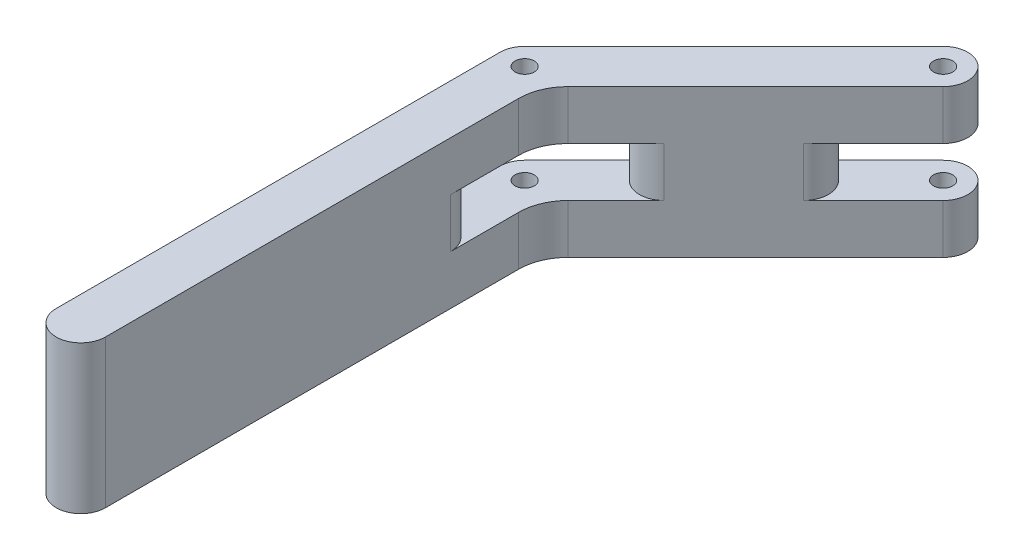
ISO-10303-21;
HEADER;
FILE_DESCRIPTION(('STEP AP214'),'2;1');
FILE_NAME('part.step','',(''),(''),'','','');
FILE_SCHEMA(('AUTOMOTIVE_DESIGN { 1 0 10303 214 1 1 1 1 }'));
ENDSEC;
DATA;
#1=APPLICATION_CONTEXT('core data for automotive mechanical design processes');
#2=APPLICATION_PROTOCOL_DEFINITION('international standard','automotive_design',2000,#1);
#3=PRODUCT_CONTEXT('',#1,'mechanical');
#4=PRODUCT('Part','Part','',(#3));
#5=PRODUCT_RELATED_PRODUCT_CATEGORY('part','',(#4));
#6=PRODUCT_DEFINITION_FORMATION('','',#4);
#7=PRODUCT_DEFINITION_CONTEXT('part definition',#1,'design');
#8=PRODUCT_DEFINITION('design','',#6,#7);
#9=PRODUCT_DEFINITION_SHAPE('','',#8);
#10=(LENGTH_UNIT() NAMED_UNIT(*) SI_UNIT(.MILLI.,.METRE.));
#11=(NAMED_UNIT(*) PLANE_ANGLE_UNIT() SI_UNIT($,.RADIAN.));
#12=(NAMED_UNIT(*) SI_UNIT($,.STERADIAN.) SOLID_ANGLE_UNIT());
#13=UNCERTAINTY_MEASURE_WITH_UNIT(LENGTH_MEASURE(1.E-05),#10,'distance_accuracy_value','');
#14=(GEOMETRIC_REPRESENTATION_CONTEXT(3) GLOBAL_UNCERTAINTY_ASSIGNED_CONTEXT((#13)) GLOBAL_UNIT_ASSIGNED_CONTEXT((#10,
#11,#12)) REPRESENTATION_CONTEXT('',''));
#15=CARTESIAN_POINT('',(0.,0.,0.));
#16=DIRECTION('',(0.,0.,1.));
#17=DIRECTION('',(1.,0.,0.));
#18=AXIS2_PLACEMENT_3D('',#15,#16,#17);
#19=CARTESIAN_POINT('',(0.,10.,0.));
#20=DIRECTION('',(0.,1.,0.));
#21=DIRECTION('',(0.,0.,1.));
#22=AXIS2_PLACEMENT_3D('',#19,#20,#21);
#23=PLANE('',#22);
#24=CARTESIAN_POINT('',(42.4264068711929,10.,-132.426406871193));
#25=DIRECTION('',(0.,1.,0.));
#26=DIRECTION('',(0.,0.,1.));
#27=AXIS2_PLACEMENT_3D('',#24,#25,#26);
#28=CIRCLE('',#27,1.95);
#29=CARTESIAN_POINT('',(42.4264068711929,10.,-130.476406871193));
#30=VERTEX_POINT('',#29);
#31=EDGE_CURVE('E285',#30,#30,#28,.T.);
#32=ORIENTED_EDGE('',*,*,#31,.F.);
#33=EDGE_LOOP('',(#32));
#34=FACE_BOUND('',#33,.T.);
#35=DIRECTION('',(0.707106781186549,0.,-0.707106781186546));
#36=VECTOR('',#35,1.);
#37=CARTESIAN_POINT('',(-48.5355339059327,10.,-48.5355339059329));
#38=LINE('',#37,#36);
#39=CARTESIAN_POINT('',(24.7487373415292,10.,-121.819805153395));
#40=VERTEX_POINT('',#39);
#41=CARTESIAN_POINT('',(38.8908729652602,10.,-135.961940777126));
#42=VERTEX_POINT('',#41);
#43=EDGE_CURVE('E57',#40,#42,#38,.T.);
#44=ORIENTED_EDGE('',*,*,#43,.F.);
#45=CARTESIAN_POINT('',(28.2842712474619,10.,-118.284271247462));
#46=DIRECTION('',(0.,1.,0.));
#47=DIRECTION('',(0.,0.,1.));
#48=AXIS2_PLACEMENT_3D('',#45,#46,#47);
#49=CIRCLE('',#48,4.99999999999999);
#50=CARTESIAN_POINT('',(31.8198051533947,10.,-114.748737341529));
#51=VERTEX_POINT('',#50);
#52=EDGE_CURVE('E209',#51,#40,#49,.T.);
#53=ORIENTED_EDGE('',*,*,#52,.F.);
#54=DIRECTION('',(0.707106781186548,0.,-0.707106781186547));
#55=VECTOR('',#54,1.);
#56=CARTESIAN_POINT('',(-41.4644660940673,10.,-41.4644660940674));
#57=LINE('',#56,#55);
#58=CARTESIAN_POINT('',(45.9619407771256,10.,-128.89087296526));
#59=VERTEX_POINT('',#58);
#60=EDGE_CURVE('E274',#51,#59,#57,.T.);
#61=ORIENTED_EDGE('',*,*,#60,.T.);
#62=CARTESIAN_POINT('',(42.4264068711929,10.,-132.426406871193));
#63=DIRECTION('',(0.,1.,0.));
#64=DIRECTION('',(0.,0.,1.));
#65=AXIS2_PLACEMENT_3D('',#62,#63,#64);
#66=CIRCLE('',#65,4.99999999999998);
#67=EDGE_CURVE('E278',#59,#42,#66,.T.);
#68=ORIENTED_EDGE('',*,*,#67,.T.);
#69=EDGE_LOOP('',(#44,#53,#61,#68));
#70=FACE_BOUND('',#69,.T.);
#71=ADVANCED_FACE('F41',(#34,#70),#23,.T.);
#72=CARTESIAN_POINT('',(0.,10.,-90.));
#73=DIRECTION('',(0.,1.,0.));
#74=DIRECTION('',(0.,0.,1.));
#75=AXIS2_PLACEMENT_3D('',#72,#73,#74);
#76=CIRCLE('',#75,1.95);
#77=CARTESIAN_POINT('',(0.,10.,-88.05));
#78=VERTEX_POINT('',#77);
#79=EDGE_CURVE('E281',#78,#78,#76,.T.);
#80=ORIENTED_EDGE('',*,*,#79,.F.);
#81=EDGE_LOOP('',(#80));
#82=FACE_BOUND('',#81,.T.);
#83=CARTESIAN_POINT('',(7.92893218813452,10.,-90.857864376269));
#84=VERTEX_POINT('',#83);
#85=CARTESIAN_POINT('',(17.6776695296637,10.,-100.606601717798));
#86=VERTEX_POINT('',#85);
#87=EDGE_CURVE('E275',#84,#86,#57,.T.);
#88=ORIENTED_EDGE('',*,*,#87,.T.);
#89=CARTESIAN_POINT('',(14.1421356237309,10.,-104.142135623731));
#90=DIRECTION('',(0.,1.,0.));
#91=DIRECTION('',(0.,0.,1.));
#92=AXIS2_PLACEMENT_3D('',#89,#90,#91);
#93=CIRCLE('',#92,5.);
#94=CARTESIAN_POINT('',(10.6066017177983,10.,-107.677669529664));
#95=VERTEX_POINT('',#94);
#96=EDGE_CURVE('E65',#95,#86,#93,.T.);
#97=ORIENTED_EDGE('',*,*,#96,.F.);
#98=CARTESIAN_POINT('',(-3.53553390593273,10.,-93.5355339059327));
#99=VERTEX_POINT('',#98);
#100=EDGE_CURVE('E261',#99,#95,#38,.T.);
#101=ORIENTED_EDGE('',*,*,#100,.F.);
#102=CARTESIAN_POINT('',(0.,10.,-90.));
#103=DIRECTION('',(0.,1.,0.));
#104=DIRECTION('',(0.,0.,1.));
#105=AXIS2_PLACEMENT_3D('',#102,#103,#104);
#106=CIRCLE('',#105,5.);
#107=CARTESIAN_POINT('',(-5.,10.,-90.));
#108=VERTEX_POINT('',#107);
#109=EDGE_CURVE('E264',#99,#108,#106,.T.);
#110=ORIENTED_EDGE('',*,*,#109,.T.);
#111=DIRECTION('',(0.,0.,-1.));
#112=VECTOR('',#111,1.);
#113=CARTESIAN_POINT('',(-5.,10.,0.));
#114=LINE('',#113,#112);
#115=CARTESIAN_POINT('',(-5.,10.,-70.));
#116=VERTEX_POINT('',#115);
#117=EDGE_CURVE('E268',#116,#108,#114,.T.);
#118=ORIENTED_EDGE('',*,*,#117,.F.);
#119=CARTESIAN_POINT('',(0.,10.,-70.));
#120=DIRECTION('',(0.,1.,0.));
#121=DIRECTION('',(0.,0.,1.));
#122=AXIS2_PLACEMENT_3D('',#119,#120,#121);
#123=CIRCLE('',#122,5.);
#124=CARTESIAN_POINT('',(5.,10.,-70.));
#125=VERTEX_POINT('',#124);
#126=EDGE_CURVE('E244',#125,#116,#123,.T.);
#127=ORIENTED_EDGE('',*,*,#126,.F.);
#128=DIRECTION('',(0.,0.,-1.));
#129=VECTOR('',#128,1.);
#130=CARTESIAN_POINT('',(5.,10.,0.));
#131=LINE('',#130,#129);
#132=CARTESIAN_POINT('',(5.,10.,-83.7867965644035));
#133=VERTEX_POINT('',#132);
#134=EDGE_CURVE('E271',#125,#133,#131,.T.);
#135=ORIENTED_EDGE('',*,*,#134,.T.);
#136=CARTESIAN_POINT('',(15.,10.,-83.7867965644035));
#137=DIRECTION('',(0.,1.,0.));
#138=DIRECTION('',(0.,0.,1.));
#139=AXIS2_PLACEMENT_3D('',#136,#137,#138);
#140=CIRCLE('',#139,10.);
#141=EDGE_CURVE('E11',#133,#84,#140,.F.);
#142=ORIENTED_EDGE('',*,*,#141,.T.);
#143=EDGE_LOOP('',(#88,#97,#101,#110,#118,#127,#135,#142));
#144=FACE_BOUND('',#143,.T.);
#145=ADVANCED_FACE('F365',(#82,#144),#23,.T.);
#146=CARTESIAN_POINT('',(-48.5355339059327,10.,-48.5355339059329));
#147=DIRECTION('',(-0.707106781186546,0.,-0.707106781186549));
#148=DIRECTION('',(-0.707106781186549,0.,0.707106781186546));
#149=AXIS2_PLACEMENT_3D('',#146,#147,#148);
#150=PLANE('',#149);
#151=DIRECTION('',(0.707106781186549,0.,-0.707106781186546));
#152=VECTOR('',#151,1.);
#153=CARTESIAN_POINT('',(-48.5355339059327,0.,-48.5355339059329));
#154=LINE('',#153,#152);
#155=CARTESIAN_POINT('',(-3.53553390593273,0.,-93.5355339059327));
#156=VERTEX_POINT('',#155);
#157=CARTESIAN_POINT('',(38.8908729652602,0.,-135.961940777126));
#158=VERTEX_POINT('',#157);
#159=EDGE_CURVE('E260',#156,#158,#154,.T.);
#160=ORIENTED_EDGE('',*,*,#159,.F.);
#161=DIRECTION('',(0.,-1.,0.));
#162=VECTOR('',#161,1.);
#163=CARTESIAN_POINT('',(-3.53553390593273,10.,-93.5355339059327));
#164=LINE('',#163,#162);
#165=EDGE_CURVE('E339',#99,#156,#164,.T.);
#166=ORIENTED_EDGE('',*,*,#165,.F.);
#167=ORIENTED_EDGE('',*,*,#100,.T.);
#168=DIRECTION('',(0.,-1.,0.));
#169=VECTOR('',#168,1.);
#170=CARTESIAN_POINT('',(10.6066017177982,20.,-107.677669529664));
#171=LINE('',#170,#169);
#172=CARTESIAN_POINT('',(10.6066017177982,20.,-107.677669529664));
#173=VERTEX_POINT('',#172);
#174=EDGE_CURVE('E237',#173,#95,#171,.T.);
#175=ORIENTED_EDGE('',*,*,#174,.F.);
#176=DIRECTION('',(-0.707106781186549,0.,0.707106781186546));
#177=VECTOR('',#176,1.);
#178=CARTESIAN_POINT('',(-48.5355339059327,20.,-48.5355339059329));
#179=LINE('',#178,#177);
#180=CARTESIAN_POINT('',(-3.53553390593273,20.,-93.5355339059327));
#181=VERTEX_POINT('',#180);
#182=EDGE_CURVE('E380',#173,#181,#179,.T.);
#183=ORIENTED_EDGE('',*,*,#182,.T.);
#184=DIRECTION('',(0.,-1.,0.));
#185=VECTOR('',#184,1.);
#186=CARTESIAN_POINT('',(-3.53553390593273,30.,-93.5355339059327));
#187=LINE('',#186,#185);
#188=CARTESIAN_POINT('',(-3.53553390593273,30.,-93.5355339059327));
#189=VERTEX_POINT('',#188);
#190=EDGE_CURVE('E215',#189,#181,#187,.T.);
#191=ORIENTED_EDGE('',*,*,#190,.F.);
#192=DIRECTION('',(-0.707106781186549,0.,0.707106781186546));
#193=VECTOR('',#192,1.);
#194=CARTESIAN_POINT('',(-48.5355339059327,30.,-48.5355339059329));
#195=LINE('',#194,#193);
#196=CARTESIAN_POINT('',(38.8908729652602,30.,-135.961940777125));
#197=VERTEX_POINT('',#196);
#198=EDGE_CURVE('E190',#197,#189,#195,.T.);
#199=ORIENTED_EDGE('',*,*,#198,.F.);
#200=DIRECTION('',(0.,-1.,0.));
#201=VECTOR('',#200,1.);
#202=CARTESIAN_POINT('',(38.8908729652602,30.,-135.961940777125));
#203=LINE('',#202,#201);
#204=CARTESIAN_POINT('',(38.8908729652602,20.,-135.961940777125));
#205=VERTEX_POINT('',#204);
#206=EDGE_CURVE('E186',#197,#205,#203,.T.);
#207=ORIENTED_EDGE('',*,*,#206,.T.);
#208=CARTESIAN_POINT('',(24.7487373415292,20.,-121.819805153395));
#209=VERTEX_POINT('',#208);
#210=EDGE_CURVE('E387',#205,#209,#179,.T.);
#211=ORIENTED_EDGE('',*,*,#210,.T.);
#212=DIRECTION('',(0.,-1.,0.));
#213=VECTOR('',#212,1.);
#214=CARTESIAN_POINT('',(24.7487373415292,20.,-121.819805153395));
#215=LINE('',#214,#213);
#216=EDGE_CURVE('E241',#209,#40,#215,.T.);
#217=ORIENTED_EDGE('',*,*,#216,.T.);
#218=ORIENTED_EDGE('',*,*,#43,.T.);
#219=DIRECTION('',(0.,-1.,0.));
#220=VECTOR('',#219,1.);
#221=CARTESIAN_POINT('',(38.8908729652602,10.,-135.961940777126));
#222=LINE('',#221,#220);
#223=EDGE_CURVE('E289',#42,#158,#222,.T.);
#224=ORIENTED_EDGE('',*,*,#223,.T.);
#225=EDGE_LOOP('',(#160,#166,#167,#175,#183,#191,#199,#207,#211,#217,#218,#224));
#226=FACE_BOUND('',#225,.T.);
#227=ADVANCED_FACE('F430',(#226),#150,.T.);
#228=CARTESIAN_POINT('',(0.,10.,-90.));
#229=DIRECTION('',(0.,-1.,0.));
#230=DIRECTION('',(0.,0.,-1.));
#231=AXIS2_PLACEMENT_3D('',#228,#229,#230);
#232=CYLINDRICAL_SURFACE('',#231,5.);
#233=CARTESIAN_POINT('',(0.,0.,-90.));
#234=DIRECTION('',(0.,1.,0.));
#235=DIRECTION('',(0.,0.,1.));
#236=AXIS2_PLACEMENT_3D('',#233,#234,#235);
#237=CIRCLE('',#236,5.);
#238=CARTESIAN_POINT('',(-5.,0.,-90.));
#239=VERTEX_POINT('',#238);
#240=EDGE_CURVE('E293',#156,#239,#237,.T.);
#241=ORIENTED_EDGE('',*,*,#240,.T.);
#242=DIRECTION('',(0.,-1.,0.));
#243=VECTOR('',#242,1.);
#244=CARTESIAN_POINT('',(-5.,10.,-90.));
#245=LINE('',#244,#243);
#246=EDGE_CURVE('E336',#108,#239,#245,.T.);
#247=ORIENTED_EDGE('',*,*,#246,.F.);
#248=ORIENTED_EDGE('',*,*,#109,.F.);
#249=ORIENTED_EDGE('',*,*,#165,.T.);
#250=EDGE_LOOP('',(#241,#247,#248,#249));
#251=FACE_BOUND('',#250,.T.);
#252=ADVANCED_FACE('F517',(#251),#232,.T.);
#253=CARTESIAN_POINT('',(-5.,10.,0.));
#254=DIRECTION('',(-1.,0.,0.));
#255=DIRECTION('',(0.,0.,1.));
#256=AXIS2_PLACEMENT_3D('',#253,#254,#255);
#257=PLANE('',#256);
#258=DIRECTION('',(0.,0.,-1.));
#259=VECTOR('',#258,1.);
#260=CARTESIAN_POINT('',(-5.,0.,0.));
#261=LINE('',#260,#259);
#262=CARTESIAN_POINT('',(-5.,0.,0.));
#263=VERTEX_POINT('',#262);
#264=EDGE_CURVE('E297',#263,#239,#261,.T.);
#265=ORIENTED_EDGE('',*,*,#264,.F.);
#266=DIRECTION('',(0.,-1.,0.));
#267=VECTOR('',#266,1.);
#268=CARTESIAN_POINT('',(-5.,10.,0.));
#269=LINE('',#268,#267);
#270=CARTESIAN_POINT('',(-5.,30.,0.));
#271=VERTEX_POINT('',#270);
#272=EDGE_CURVE('E333',#271,#263,#269,.T.);
#273=ORIENTED_EDGE('',*,*,#272,.F.);
#274=DIRECTION('',(0.,0.,1.));
#275=VECTOR('',#274,1.);
#276=CARTESIAN_POINT('',(-5.,30.,0.));
#277=LINE('',#276,#275);
#278=CARTESIAN_POINT('',(-5.,30.,-90.));
#279=VERTEX_POINT('',#278);
#280=EDGE_CURVE('E435',#279,#271,#277,.T.);
#281=ORIENTED_EDGE('',*,*,#280,.F.);
#282=DIRECTION('',(0.,-1.,0.));
#283=VECTOR('',#282,1.);
#284=CARTESIAN_POINT('',(-5.,30.,-90.));
#285=LINE('',#284,#283);
#286=CARTESIAN_POINT('',(-5.,20.,-90.));
#287=VERTEX_POINT('',#286);
#288=EDGE_CURVE('E420',#279,#287,#285,.T.);
#289=ORIENTED_EDGE('',*,*,#288,.T.);
#290=DIRECTION('',(0.,0.,1.));
#291=VECTOR('',#290,1.);
#292=CARTESIAN_POINT('',(-5.,20.,0.));
#293=LINE('',#292,#291);
#294=CARTESIAN_POINT('',(-5.,20.,-70.));
#295=VERTEX_POINT('',#294);
#296=EDGE_CURVE('E398',#287,#295,#293,.T.);
#297=ORIENTED_EDGE('',*,*,#296,.T.);
#298=DIRECTION('',(0.,-1.,0.));
#299=VECTOR('',#298,1.);
#300=CARTESIAN_POINT('',(-5.,20.,-70.));
#301=LINE('',#300,#299);
#302=EDGE_CURVE('E249',#295,#116,#301,.T.);
#303=ORIENTED_EDGE('',*,*,#302,.T.);
#304=ORIENTED_EDGE('',*,*,#117,.T.);
#305=ORIENTED_EDGE('',*,*,#246,.T.);
#306=EDGE_LOOP('',(#265,#273,#281,#289,#297,#303,#304,#305));
#307=FACE_BOUND('',#306,.T.);
#308=ADVANCED_FACE('F513',(#307),#257,.T.);
#309=CARTESIAN_POINT('',(0.,10.,0.));
#310=DIRECTION('',(0.,-1.,0.));
#311=DIRECTION('',(0.,0.,-1.));
#312=AXIS2_PLACEMENT_3D('',#309,#310,#311);
#313=CYLINDRICAL_SURFACE('',#312,5.);
#314=CARTESIAN_POINT('',(0.,0.,0.));
#315=DIRECTION('',(0.,1.,0.));
#316=DIRECTION('',(0.,0.,1.));
#317=AXIS2_PLACEMENT_3D('',#314,#315,#316);
#318=CIRCLE('',#317,5.);
#319=CARTESIAN_POINT('',(5.,0.,0.));
#320=VERTEX_POINT('',#319);
#321=EDGE_CURVE('E301',#263,#320,#318,.T.);
#322=ORIENTED_EDGE('',*,*,#321,.T.);
#323=DIRECTION('',(0.,-1.,0.));
#324=VECTOR('',#323,1.);
#325=CARTESIAN_POINT('',(5.,10.,0.));
#326=LINE('',#325,#324);
#327=CARTESIAN_POINT('',(5.,30.,0.));
#328=VERTEX_POINT('',#327);
#329=EDGE_CURVE('E329',#328,#320,#326,.T.);
#330=ORIENTED_EDGE('',*,*,#329,.F.);
#331=CARTESIAN_POINT('',(0.,30.,0.));
#332=DIRECTION('',(0.,1.,0.));
#333=DIRECTION('',(0.,0.,1.));
#334=AXIS2_PLACEMENT_3D('',#331,#332,#333);
#335=CIRCLE('',#334,5.);
#336=EDGE_CURVE('E441',#271,#328,#335,.T.);
#337=ORIENTED_EDGE('',*,*,#336,.F.);
#338=ORIENTED_EDGE('',*,*,#272,.T.);
#339=EDGE_LOOP('',(#322,#330,#337,#338));
#340=FACE_BOUND('',#339,.T.);
#341=ADVANCED_FACE('F510',(#340),#313,.T.);
#342=CARTESIAN_POINT('',(5.,10.,0.));
#343=DIRECTION('',(-1.,0.,0.));
#344=DIRECTION('',(0.,0.,1.));
#345=AXIS2_PLACEMENT_3D('',#342,#343,#344);
#346=PLANE('',#345);
#347=DIRECTION('',(0.,0.,-1.));
#348=VECTOR('',#347,1.);
#349=CARTESIAN_POINT('',(5.,0.,0.));
#350=LINE('',#349,#348);
#351=CARTESIAN_POINT('',(5.,0.,-83.7867965644035));
#352=VERTEX_POINT('',#351);
#353=EDGE_CURVE('E304',#320,#352,#350,.T.);
#354=ORIENTED_EDGE('',*,*,#353,.T.);
#355=DIRECTION('',(0.,-1.,0.));
#356=VECTOR('',#355,1.);
#357=CARTESIAN_POINT('',(5.,10.,-83.7867965644035));
#358=LINE('',#357,#356);
#359=EDGE_CURVE('E346',#352,#133,#358,.F.);
#360=ORIENTED_EDGE('',*,*,#359,.T.);
#361=ORIENTED_EDGE('',*,*,#134,.F.);
#362=DIRECTION('',(0.,-1.,0.));
#363=VECTOR('',#362,1.);
#364=CARTESIAN_POINT('',(5.,20.,-70.));
#365=LINE('',#364,#363);
#366=CARTESIAN_POINT('',(5.,20.,-70.));
#367=VERTEX_POINT('',#366);
#368=EDGE_CURVE('E256',#367,#125,#365,.T.);
#369=ORIENTED_EDGE('',*,*,#368,.F.);
#370=DIRECTION('',(0.,0.,-1.));
#371=VECTOR('',#370,1.);
#372=CARTESIAN_POINT('',(5.,20.,0.));
#373=LINE('',#372,#371);
#374=CARTESIAN_POINT('',(5.,20.,-83.7867965644035));
#375=VERTEX_POINT('',#374);
#376=EDGE_CURVE('E402',#367,#375,#373,.T.);
#377=ORIENTED_EDGE('',*,*,#376,.T.);
#378=DIRECTION('',(0.,-1.,0.));
#379=VECTOR('',#378,1.);
#380=CARTESIAN_POINT('',(5.,30.,-83.7867965644035));
#381=LINE('',#380,#379);
#382=CARTESIAN_POINT('',(5.,30.,-83.7867965644035));
#383=VERTEX_POINT('',#382);
#384=EDGE_CURVE('E415',#383,#375,#381,.T.);
#385=ORIENTED_EDGE('',*,*,#384,.F.);
#386=DIRECTION('',(0.,0.,-1.));
#387=VECTOR('',#386,1.);
#388=CARTESIAN_POINT('',(5.,30.,0.));
#389=LINE('',#388,#387);
#390=EDGE_CURVE('E445',#328,#383,#389,.T.);
#391=ORIENTED_EDGE('',*,*,#390,.F.);
#392=ORIENTED_EDGE('',*,*,#329,.T.);
#393=EDGE_LOOP('',(#354,#360,#361,#369,#377,#385,#391,#392));
#394=FACE_BOUND('',#393,.T.);
#395=ADVANCED_FACE('F361',(#394),#346,.F.);
#396=CARTESIAN_POINT('',(-41.4644660940673,10.,-41.4644660940674));
#397=DIRECTION('',(-0.707106781186547,0.,-0.707106781186548));
#398=DIRECTION('',(-0.707106781186548,0.,0.707106781186547));
#399=AXIS2_PLACEMENT_3D('',#396,#397,#398);
#400=PLANE('',#399);
#401=ORIENTED_EDGE('',*,*,#87,.F.);
#402=DIRECTION('',(0.,-1.,0.));
#403=VECTOR('',#402,1.);
#404=CARTESIAN_POINT('',(7.92893218813452,0.,-90.857864376269));
#405=LINE('',#404,#403);
#406=CARTESIAN_POINT('',(7.92893218813452,0.,-90.857864376269));
#407=VERTEX_POINT('',#406);
#408=EDGE_CURVE('E342',#84,#407,#405,.T.);
#409=ORIENTED_EDGE('',*,*,#408,.T.);
#410=DIRECTION('',(0.707106781186548,0.,-0.707106781186547));
#411=VECTOR('',#410,1.);
#412=CARTESIAN_POINT('',(-41.4644660940673,0.,-41.4644660940674));
#413=LINE('',#412,#411);
#414=CARTESIAN_POINT('',(45.9619407771256,0.,-128.89087296526));
#415=VERTEX_POINT('',#414);
#416=EDGE_CURVE('E308',#407,#415,#413,.T.);
#417=ORIENTED_EDGE('',*,*,#416,.T.);
#418=DIRECTION('',(0.,-1.,0.));
#419=VECTOR('',#418,1.);
#420=CARTESIAN_POINT('',(45.9619407771256,10.,-128.89087296526));
#421=LINE('',#420,#419);
#422=EDGE_CURVE('E325',#59,#415,#421,.T.);
#423=ORIENTED_EDGE('',*,*,#422,.F.);
#424=ORIENTED_EDGE('',*,*,#60,.F.);
#425=DIRECTION('',(0.,-1.,0.));
#426=VECTOR('',#425,1.);
#427=CARTESIAN_POINT('',(31.8198051533947,20.,-114.748737341529));
#428=LINE('',#427,#426);
#429=CARTESIAN_POINT('',(31.8198051533947,20.,-114.748737341529));
#430=VERTEX_POINT('',#429);
#431=EDGE_CURVE('E226',#430,#51,#428,.T.);
#432=ORIENTED_EDGE('',*,*,#431,.F.);
#433=DIRECTION('',(0.70710678118655,0.,-0.707106781186545));
#434=VECTOR('',#433,1.);
#435=CARTESIAN_POINT('',(-41.4644660940674,20.,-41.4644660940677));
#436=LINE('',#435,#434);
#437=CARTESIAN_POINT('',(45.9619407771256,20.,-128.89087296526));
#438=VERTEX_POINT('',#437);
#439=EDGE_CURVE('E206',#430,#438,#436,.T.);
#440=ORIENTED_EDGE('',*,*,#439,.T.);
#441=DIRECTION('',(0.,-1.,0.));
#442=VECTOR('',#441,1.);
#443=CARTESIAN_POINT('',(45.9619407771256,30.,-128.89087296526));
#444=LINE('',#443,#442);
#445=CARTESIAN_POINT('',(45.9619407771256,30.,-128.89087296526));
#446=VERTEX_POINT('',#445);
#447=EDGE_CURVE('E184',#446,#438,#444,.T.);
#448=ORIENTED_EDGE('',*,*,#447,.F.);
#449=DIRECTION('',(0.70710678118655,0.,-0.707106781186545));
#450=VECTOR('',#449,1.);
#451=CARTESIAN_POINT('',(-41.4644660940674,30.,-41.4644660940677));
#452=LINE('',#451,#450);
#453=CARTESIAN_POINT('',(7.92893218813453,30.,-90.857864376269));
#454=VERTEX_POINT('',#453);
#455=EDGE_CURVE('E191',#454,#446,#452,.T.);
#456=ORIENTED_EDGE('',*,*,#455,.F.);
#457=DIRECTION('',(0.,-1.,0.));
#458=VECTOR('',#457,1.);
#459=CARTESIAN_POINT('',(7.92893218813453,30.,-90.857864376269));
#460=LINE('',#459,#458);
#461=CARTESIAN_POINT('',(7.92893218813453,20.,-90.857864376269));
#462=VERTEX_POINT('',#461);
#463=EDGE_CURVE('E412',#454,#462,#460,.T.);
#464=ORIENTED_EDGE('',*,*,#463,.T.);
#465=CARTESIAN_POINT('',(17.6776695296636,20.,-100.606601717798));
#466=VERTEX_POINT('',#465);
#467=EDGE_CURVE('E368',#462,#466,#436,.T.);
#468=ORIENTED_EDGE('',*,*,#467,.T.);
#469=DIRECTION('',(0.,-1.,0.));
#470=VECTOR('',#469,1.);
#471=CARTESIAN_POINT('',(17.6776695296637,20.,-100.606601717798));
#472=LINE('',#471,#470);
#473=EDGE_CURVE('E233',#466,#86,#472,.T.);
#474=ORIENTED_EDGE('',*,*,#473,.T.);
#475=EDGE_LOOP('',(#401,#409,#417,#423,#424,#432,#440,#448,#456,#464,#468,#474));
#476=FACE_BOUND('',#475,.T.);
#477=ADVANCED_FACE('F204',(#476),#400,.F.);
#478=CARTESIAN_POINT('',(0.,10.,-90.));
#479=DIRECTION('',(0.,-1.,0.));
#480=DIRECTION('',(0.,0.,-1.));
#481=AXIS2_PLACEMENT_3D('',#478,#479,#480);
#482=CYLINDRICAL_SURFACE('',#481,1.95);
#483=ORIENTED_EDGE('',*,*,#79,.T.);
#484=EDGE_LOOP('',(#483));
#485=FACE_BOUND('',#484,.T.);
#486=CARTESIAN_POINT('',(0.,0.,-90.));
#487=DIRECTION('',(0.,1.,0.));
#488=DIRECTION('',(0.,0.,1.));
#489=AXIS2_PLACEMENT_3D('',#486,#487,#488);
#490=CIRCLE('',#489,1.95);
#491=CARTESIAN_POINT('',(0.,0.,-88.05));
#492=VERTEX_POINT('',#491);
#493=EDGE_CURVE('E315',#492,#492,#490,.T.);
#494=ORIENTED_EDGE('',*,*,#493,.F.);
#495=EDGE_LOOP('',(#494));
#496=FACE_BOUND('',#495,.T.);
#497=ADVANCED_FACE('F499',(#485,#496),#482,.F.);
#498=CARTESIAN_POINT('',(42.4264068711929,10.,-132.426406871193));
#499=DIRECTION('',(0.,-1.,0.));
#500=DIRECTION('',(0.,0.,-1.));
#501=AXIS2_PLACEMENT_3D('',#498,#499,#500);
#502=CYLINDRICAL_SURFACE('',#501,4.99999999999998);
#503=CARTESIAN_POINT('',(42.4264068711929,0.,-132.426406871193));
#504=DIRECTION('',(0.,1.,0.));
#505=DIRECTION('',(0.,0.,1.));
#506=AXIS2_PLACEMENT_3D('',#503,#504,#505);
#507=CIRCLE('',#506,4.99999999999998);
#508=EDGE_CURVE('E311',#415,#158,#507,.T.);
#509=ORIENTED_EDGE('',*,*,#508,.T.);
#510=ORIENTED_EDGE('',*,*,#223,.F.);
#511=ORIENTED_EDGE('',*,*,#67,.F.);
#512=ORIENTED_EDGE('',*,*,#422,.T.);
#513=EDGE_LOOP('',(#509,#510,#511,#512));
#514=FACE_BOUND('',#513,.T.);
#515=ADVANCED_FACE('F497',(#514),#502,.T.);
#516=CARTESIAN_POINT('',(42.4264068711929,10.,-132.426406871193));
#517=DIRECTION('',(0.,-1.,0.));
#518=DIRECTION('',(0.,0.,-1.));
#519=AXIS2_PLACEMENT_3D('',#516,#517,#518);
#520=CYLINDRICAL_SURFACE('',#519,1.95);
#521=ORIENTED_EDGE('',*,*,#31,.T.);
#522=EDGE_LOOP('',(#521));
#523=FACE_BOUND('',#522,.T.);
#524=CARTESIAN_POINT('',(42.4264068711929,0.,-132.426406871193));
#525=DIRECTION('',(0.,1.,0.));
#526=DIRECTION('',(0.,0.,1.));
#527=AXIS2_PLACEMENT_3D('',#524,#525,#526);
#528=CIRCLE('',#527,1.95);
#529=CARTESIAN_POINT('',(42.4264068711929,0.,-130.476406871193));
#530=VERTEX_POINT('',#529);
#531=EDGE_CURVE('E319',#530,#530,#528,.T.);
#532=ORIENTED_EDGE('',*,*,#531,.F.);
#533=EDGE_LOOP('',(#532));
#534=FACE_BOUND('',#533,.T.);
#535=ADVANCED_FACE('F494',(#523,#534),#520,.F.);
#536=CARTESIAN_POINT('',(0.,0.,0.));
#537=DIRECTION('',(0.,1.,0.));
#538=DIRECTION('',(0.,0.,1.));
#539=AXIS2_PLACEMENT_3D('',#536,#537,#538);
#540=PLANE('',#539);
#541=ORIENTED_EDGE('',*,*,#159,.T.);
#542=ORIENTED_EDGE('',*,*,#508,.F.);
#543=ORIENTED_EDGE('',*,*,#416,.F.);
#544=CARTESIAN_POINT('',(15.,0.,-83.7867965644035));
#545=DIRECTION('',(0.,1.,0.));
#546=DIRECTION('',(0.,0.,1.));
#547=AXIS2_PLACEMENT_3D('',#544,#545,#546);
#548=CIRCLE('',#547,10.);
#549=EDGE_CURVE('E50',#407,#352,#548,.T.);
#550=ORIENTED_EDGE('',*,*,#549,.T.);
#551=ORIENTED_EDGE('',*,*,#353,.F.);
#552=ORIENTED_EDGE('',*,*,#321,.F.);
#553=ORIENTED_EDGE('',*,*,#264,.T.);
#554=ORIENTED_EDGE('',*,*,#240,.F.);
#555=EDGE_LOOP('',(#541,#542,#543,#550,#551,#552,#553,#554));
#556=FACE_BOUND('',#555,.T.);
#557=ORIENTED_EDGE('',*,*,#493,.T.);
#558=EDGE_LOOP('',(#557));
#559=FACE_BOUND('',#558,.T.);
#560=ORIENTED_EDGE('',*,*,#531,.T.);
#561=EDGE_LOOP('',(#560));
#562=FACE_BOUND('',#561,.T.);
#563=ADVANCED_FACE('F353',(#556,#559,#562),#540,.F.);
#564=CARTESIAN_POINT('',(15.,10.,-83.7867965644035));
#565=DIRECTION('',(0.,1.,0.));
#566=DIRECTION('',(0.,0.,1.));
#567=AXIS2_PLACEMENT_3D('',#564,#565,#566);
#568=CYLINDRICAL_SURFACE('',#567,10.);
#569=ORIENTED_EDGE('',*,*,#141,.F.);
#570=ORIENTED_EDGE('',*,*,#359,.F.);
#571=ORIENTED_EDGE('',*,*,#549,.F.);
#572=ORIENTED_EDGE('',*,*,#408,.F.);
#573=EDGE_LOOP('',(#569,#570,#571,#572));
#574=FACE_BOUND('',#573,.T.);
#575=ADVANCED_FACE('F43',(#574),#568,.F.);
#576=CARTESIAN_POINT('',(0.,20.,-70.));
#577=DIRECTION('',(0.,-1.,0.));
#578=DIRECTION('',(0.,0.,-1.));
#579=AXIS2_PLACEMENT_3D('',#576,#577,#578);
#580=CYLINDRICAL_SURFACE('',#579,5.);
#581=ORIENTED_EDGE('',*,*,#126,.T.);
#582=ORIENTED_EDGE('',*,*,#302,.F.);
#583=CARTESIAN_POINT('',(0.,20.,-70.));
#584=DIRECTION('',(0.,1.,0.));
#585=DIRECTION('',(0.,0.,1.));
#586=AXIS2_PLACEMENT_3D('',#583,#584,#585);
#587=CIRCLE('',#586,5.);
#588=EDGE_CURVE('E245',#367,#295,#587,.T.);
#589=ORIENTED_EDGE('',*,*,#588,.F.);
#590=ORIENTED_EDGE('',*,*,#368,.T.);
#591=EDGE_LOOP('',(#581,#582,#589,#590));
#592=FACE_BOUND('',#591,.T.);
#593=ADVANCED_FACE('F490',(#592),#580,.T.);
#594=CARTESIAN_POINT('',(28.2842712474619,20.,-118.284271247462));
#595=DIRECTION('',(0.,-1.,0.));
#596=DIRECTION('',(0.,0.,-1.));
#597=AXIS2_PLACEMENT_3D('',#594,#595,#596);
#598=CYLINDRICAL_SURFACE('',#597,4.99999999999999);
#599=ORIENTED_EDGE('',*,*,#52,.T.);
#600=ORIENTED_EDGE('',*,*,#216,.F.);
#601=CARTESIAN_POINT('',(28.2842712474619,20.,-118.284271247462));
#602=DIRECTION('',(0.,1.,0.));
#603=DIRECTION('',(0.,0.,1.));
#604=AXIS2_PLACEMENT_3D('',#601,#602,#603);
#605=CIRCLE('',#604,4.99999999999999);
#606=EDGE_CURVE('E219',#430,#209,#605,.T.);
#607=ORIENTED_EDGE('',*,*,#606,.F.);
#608=ORIENTED_EDGE('',*,*,#431,.T.);
#609=EDGE_LOOP('',(#599,#600,#607,#608));
#610=FACE_BOUND('',#609,.T.);
#611=ADVANCED_FACE('F573',(#610),#598,.T.);
#612=CARTESIAN_POINT('',(14.1421356237309,20.,-104.142135623731));
#613=DIRECTION('',(0.,-1.,0.));
#614=DIRECTION('',(0.,0.,-1.));
#615=AXIS2_PLACEMENT_3D('',#612,#613,#614);
#616=CYLINDRICAL_SURFACE('',#615,5.);
#617=ORIENTED_EDGE('',*,*,#96,.T.);
#618=ORIENTED_EDGE('',*,*,#473,.F.);
#619=CARTESIAN_POINT('',(14.1421356237309,20.,-104.142135623731));
#620=DIRECTION('',(0.,1.,0.));
#621=DIRECTION('',(0.,0.,1.));
#622=AXIS2_PLACEMENT_3D('',#619,#620,#621);
#623=CIRCLE('',#622,5.);
#624=EDGE_CURVE('E223',#173,#466,#623,.T.);
#625=ORIENTED_EDGE('',*,*,#624,.F.);
#626=ORIENTED_EDGE('',*,*,#174,.T.);
#627=EDGE_LOOP('',(#617,#618,#625,#626));
#628=FACE_BOUND('',#627,.T.);
#629=ADVANCED_FACE('F371',(#628),#616,.T.);
#630=CARTESIAN_POINT('',(0.,20.,0.));
#631=DIRECTION('',(0.,1.,0.));
#632=DIRECTION('',(0.,0.,1.));
#633=AXIS2_PLACEMENT_3D('',#630,#631,#632);
#634=PLANE('',#633);
#635=CARTESIAN_POINT('',(42.4264068711929,20.,-132.426406871193));
#636=DIRECTION('',(0.,1.,0.));
#637=DIRECTION('',(0.,0.,1.));
#638=AXIS2_PLACEMENT_3D('',#635,#636,#637);
#639=CIRCLE('',#638,1.95000000000001);
#640=CARTESIAN_POINT('',(42.4264068711929,20.,-130.476406871193));
#641=VERTEX_POINT('',#640);
#642=EDGE_CURVE('E453',#641,#641,#639,.T.);
#643=ORIENTED_EDGE('',*,*,#642,.T.);
#644=EDGE_LOOP('',(#643));
#645=FACE_BOUND('',#644,.T.);
#646=ORIENTED_EDGE('',*,*,#439,.F.);
#647=ORIENTED_EDGE('',*,*,#606,.T.);
#648=ORIENTED_EDGE('',*,*,#210,.F.);
#649=CARTESIAN_POINT('',(42.4264068711929,20.,-132.426406871193));
#650=DIRECTION('',(0.,1.,0.));
#651=DIRECTION('',(0.,0.,1.));
#652=AXIS2_PLACEMENT_3D('',#649,#650,#651);
#653=CIRCLE('',#652,4.99999999999998);
#654=EDGE_CURVE('E388',#438,#205,#653,.T.);
#655=ORIENTED_EDGE('',*,*,#654,.F.);
#656=EDGE_LOOP('',(#646,#647,#648,#655));
#657=FACE_BOUND('',#656,.T.);
#658=ADVANCED_FACE('F460',(#645,#657),#634,.F.);
#659=CARTESIAN_POINT('',(42.4264068711929,30.,-132.426406871193));
#660=DIRECTION('',(0.,-1.,0.));
#661=DIRECTION('',(0.,0.,-1.));
#662=AXIS2_PLACEMENT_3D('',#659,#660,#661);
#663=CYLINDRICAL_SURFACE('',#662,4.99999999999998);
#664=ORIENTED_EDGE('',*,*,#654,.T.);
#665=ORIENTED_EDGE('',*,*,#206,.F.);
#666=CARTESIAN_POINT('',(42.4264068711929,30.,-132.426406871193));
#667=DIRECTION('',(0.,1.,0.));
#668=DIRECTION('',(0.,0.,1.));
#669=AXIS2_PLACEMENT_3D('',#666,#667,#668);
#670=CIRCLE('',#669,4.99999999999998);
#671=EDGE_CURVE('E180',#446,#197,#670,.T.);
#672=ORIENTED_EDGE('',*,*,#671,.F.);
#673=ORIENTED_EDGE('',*,*,#447,.T.);
#674=EDGE_LOOP('',(#664,#665,#672,#673));
#675=FACE_BOUND('',#674,.T.);
#676=ADVANCED_FACE('F182',(#675),#663,.T.);
#677=CARTESIAN_POINT('',(0.,30.,-90.));
#678=DIRECTION('',(0.,-1.,0.));
#679=DIRECTION('',(0.,0.,-1.));
#680=AXIS2_PLACEMENT_3D('',#677,#678,#679);
#681=CYLINDRICAL_SURFACE('',#680,4.99999999999999);
#682=CARTESIAN_POINT('',(0.,20.,-90.));
#683=DIRECTION('',(0.,1.,0.));
#684=DIRECTION('',(0.,0.,1.));
#685=AXIS2_PLACEMENT_3D('',#682,#683,#684);
#686=CIRCLE('',#685,4.99999999999999);
#687=EDGE_CURVE('E382',#181,#287,#686,.T.);
#688=ORIENTED_EDGE('',*,*,#687,.T.);
#689=ORIENTED_EDGE('',*,*,#288,.F.);
#690=CARTESIAN_POINT('',(0.,30.,-90.));
#691=DIRECTION('',(0.,1.,0.));
#692=DIRECTION('',(0.,0.,1.));
#693=AXIS2_PLACEMENT_3D('',#690,#691,#692);
#694=CIRCLE('',#693,4.99999999999999);
#695=EDGE_CURVE('E428',#189,#279,#694,.T.);
#696=ORIENTED_EDGE('',*,*,#695,.F.);
#697=ORIENTED_EDGE('',*,*,#190,.T.);
#698=EDGE_LOOP('',(#688,#689,#696,#697));
#699=FACE_BOUND('',#698,.T.);
#700=ADVANCED_FACE('F426',(#699),#681,.T.);
#701=CARTESIAN_POINT('',(15.,30.,-83.7867965644035));
#702=DIRECTION('',(0.,-1.,0.));
#703=DIRECTION('',(0.,0.,-1.));
#704=AXIS2_PLACEMENT_3D('',#701,#702,#703);
#705=CYLINDRICAL_SURFACE('',#704,9.99999999999999);
#706=CARTESIAN_POINT('',(15.,20.,-83.7867965644035));
#707=DIRECTION('',(0.,1.,0.));
#708=DIRECTION('',(0.,0.,1.));
#709=AXIS2_PLACEMENT_3D('',#706,#707,#708);
#710=CIRCLE('',#709,9.99999999999999);
#711=EDGE_CURVE('E405',#462,#375,#710,.T.);
#712=ORIENTED_EDGE('',*,*,#711,.F.);
#713=ORIENTED_EDGE('',*,*,#463,.F.);
#714=CARTESIAN_POINT('',(15.,30.,-83.7867965644035));
#715=DIRECTION('',(0.,1.,0.));
#716=DIRECTION('',(0.,0.,1.));
#717=AXIS2_PLACEMENT_3D('',#714,#715,#716);
#718=CIRCLE('',#717,9.99999999999999);
#719=EDGE_CURVE('E198',#454,#383,#718,.T.);
#720=ORIENTED_EDGE('',*,*,#719,.T.);
#721=ORIENTED_EDGE('',*,*,#384,.T.);
#722=EDGE_LOOP('',(#712,#713,#720,#721));
#723=FACE_BOUND('',#722,.T.);
#724=ADVANCED_FACE('F466',(#723),#705,.F.);
#725=CARTESIAN_POINT('',(42.4264068711929,30.,-132.426406871193));
#726=DIRECTION('',(0.,-1.,0.));
#727=DIRECTION('',(0.,0.,-1.));
#728=AXIS2_PLACEMENT_3D('',#725,#726,#727);
#729=CYLINDRICAL_SURFACE('',#728,1.95000000000001);
#730=CARTESIAN_POINT('',(42.4264068711929,30.,-132.426406871193));
#731=DIRECTION('',(0.,1.,0.));
#732=DIRECTION('',(0.,0.,1.));
#733=AXIS2_PLACEMENT_3D('',#730,#731,#732);
#734=CIRCLE('',#733,1.95000000000001);
#735=CARTESIAN_POINT('',(42.4264068711929,30.,-130.476406871193));
#736=VERTEX_POINT('',#735);
#737=EDGE_CURVE('E201',#736,#736,#734,.T.);
#738=ORIENTED_EDGE('',*,*,#737,.T.);
#739=EDGE_LOOP('',(#738));
#740=FACE_BOUND('',#739,.T.);
#741=ORIENTED_EDGE('',*,*,#642,.F.);
#742=EDGE_LOOP('',(#741));
#743=FACE_BOUND('',#742,.T.);
#744=ADVANCED_FACE('F463',(#740,#743),#729,.F.);
#745=CARTESIAN_POINT('',(0.,30.,-90.));
#746=DIRECTION('',(0.,-1.,0.));
#747=DIRECTION('',(0.,0.,-1.));
#748=AXIS2_PLACEMENT_3D('',#745,#746,#747);
#749=CYLINDRICAL_SURFACE('',#748,1.94999999999999);
#750=CARTESIAN_POINT('',(0.,30.,-90.));
#751=DIRECTION('',(0.,1.,0.));
#752=DIRECTION('',(0.,0.,1.));
#753=AXIS2_PLACEMENT_3D('',#750,#751,#752);
#754=CIRCLE('',#753,1.94999999999999);
#755=CARTESIAN_POINT('',(0.,30.,-88.05));
#756=VERTEX_POINT('',#755);
#757=EDGE_CURVE('E416',#756,#756,#754,.T.);
#758=ORIENTED_EDGE('',*,*,#757,.T.);
#759=EDGE_LOOP('',(#758));
#760=FACE_BOUND('',#759,.T.);
#761=CARTESIAN_POINT('',(0.,20.,-90.));
#762=DIRECTION('',(0.,1.,0.));
#763=DIRECTION('',(0.,0.,1.));
#764=AXIS2_PLACEMENT_3D('',#761,#762,#763);
#765=CIRCLE('',#764,1.94999999999999);
#766=CARTESIAN_POINT('',(0.,20.,-88.05));
#767=VERTEX_POINT('',#766);
#768=EDGE_CURVE('E408',#767,#767,#765,.T.);
#769=ORIENTED_EDGE('',*,*,#768,.F.);
#770=EDGE_LOOP('',(#769));
#771=FACE_BOUND('',#770,.T.);
#772=ADVANCED_FACE('F465',(#760,#771),#749,.F.);
#773=CARTESIAN_POINT('',(0.,30.,0.));
#774=DIRECTION('',(0.,1.,0.));
#775=DIRECTION('',(0.,0.,1.));
#776=AXIS2_PLACEMENT_3D('',#773,#774,#775);
#777=PLANE('',#776);
#778=ORIENTED_EDGE('',*,*,#737,.F.);
#779=EDGE_LOOP('',(#778));
#780=FACE_BOUND('',#779,.T.);
#781=ORIENTED_EDGE('',*,*,#455,.T.);
#782=ORIENTED_EDGE('',*,*,#671,.T.);
#783=ORIENTED_EDGE('',*,*,#198,.T.);
#784=ORIENTED_EDGE('',*,*,#695,.T.);
#785=ORIENTED_EDGE('',*,*,#280,.T.);
#786=ORIENTED_EDGE('',*,*,#336,.T.);
#787=ORIENTED_EDGE('',*,*,#390,.T.);
#788=ORIENTED_EDGE('',*,*,#719,.F.);
#789=EDGE_LOOP('',(#781,#782,#783,#784,#785,#786,#787,#788));
#790=FACE_BOUND('',#789,.T.);
#791=ORIENTED_EDGE('',*,*,#757,.F.);
#792=EDGE_LOOP('',(#791));
#793=FACE_BOUND('',#792,.T.);
#794=ADVANCED_FACE('F195',(#780,#790,#793),#777,.T.);
#795=ORIENTED_EDGE('',*,*,#376,.F.);
#796=ORIENTED_EDGE('',*,*,#588,.T.);
#797=ORIENTED_EDGE('',*,*,#296,.F.);
#798=ORIENTED_EDGE('',*,*,#687,.F.);
#799=ORIENTED_EDGE('',*,*,#182,.F.);
#800=ORIENTED_EDGE('',*,*,#624,.T.);
#801=ORIENTED_EDGE('',*,*,#467,.F.);
#802=ORIENTED_EDGE('',*,*,#711,.T.);
#803=EDGE_LOOP('',(#795,#796,#797,#798,#799,#800,#801,#802));
#804=FACE_BOUND('',#803,.T.);
#805=ORIENTED_EDGE('',*,*,#768,.T.);
#806=EDGE_LOOP('',(#805));
#807=FACE_BOUND('',#806,.T.);
#808=ADVANCED_FACE('F375',(#804,#807),#634,.F.);
#809=CLOSED_SHELL('',(#71,#145,#227,#252,#308,#341,#395,#477,#497,#515,#535,#563,#575,#593,#611,
#629,#658,#676,#700,#724,#744,#772,#794,#808));
#810=MANIFOLD_SOLID_BREP('B2',#809);
#811=ADVANCED_BREP_SHAPE_REPRESENTATION('',(#18,#810),#14);
#812=SHAPE_DEFINITION_REPRESENTATION(#9,#811);
ENDSEC;
END-ISO-10303-21;
